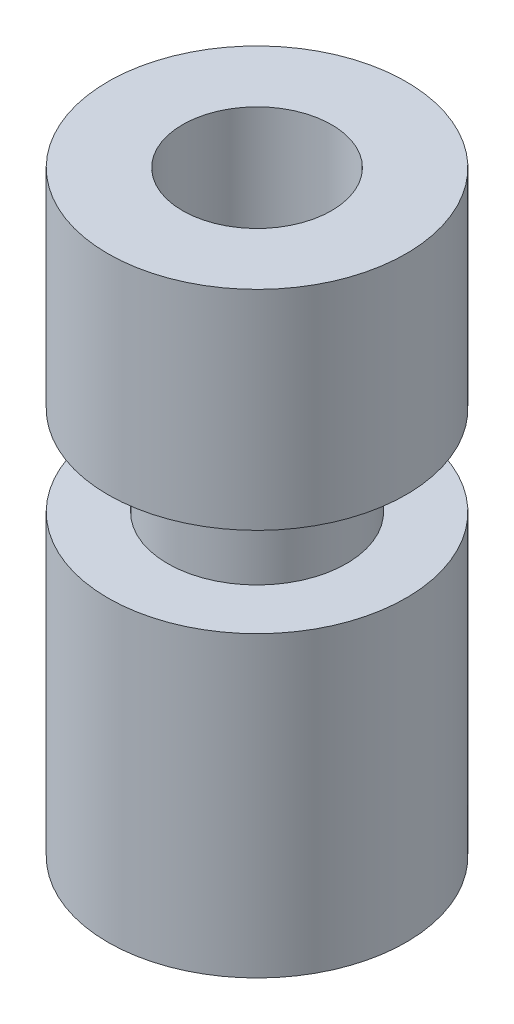
ISO-10303-21;
HEADER;
FILE_DESCRIPTION(('STEP AP214'),'2;1');
FILE_NAME('part.step','',(''),(''),'','','');
FILE_SCHEMA(('AUTOMOTIVE_DESIGN { 1 0 10303 214 1 1 1 1 }'));
ENDSEC;
DATA;
#1=APPLICATION_CONTEXT('core data for automotive mechanical design processes');
#2=APPLICATION_PROTOCOL_DEFINITION('international standard','automotive_design',2000,#1);
#3=PRODUCT_CONTEXT('',#1,'mechanical');
#4=PRODUCT('Part','Part','',(#3));
#5=PRODUCT_RELATED_PRODUCT_CATEGORY('part','',(#4));
#6=PRODUCT_DEFINITION_FORMATION('','',#4);
#7=PRODUCT_DEFINITION_CONTEXT('part definition',#1,'design');
#8=PRODUCT_DEFINITION('design','',#6,#7);
#9=PRODUCT_DEFINITION_SHAPE('','',#8);
#10=(LENGTH_UNIT() NAMED_UNIT(*) SI_UNIT(.MILLI.,.METRE.));
#11=(NAMED_UNIT(*) PLANE_ANGLE_UNIT() SI_UNIT($,.RADIAN.));
#12=(NAMED_UNIT(*) SI_UNIT($,.STERADIAN.) SOLID_ANGLE_UNIT());
#13=UNCERTAINTY_MEASURE_WITH_UNIT(LENGTH_MEASURE(1.E-05),#10,'distance_accuracy_value','');
#14=(GEOMETRIC_REPRESENTATION_CONTEXT(3) GLOBAL_UNCERTAINTY_ASSIGNED_CONTEXT((#13)) GLOBAL_UNIT_ASSIGNED_CONTEXT((#10,
#11,#12)) REPRESENTATION_CONTEXT('',''));
#15=CARTESIAN_POINT('',(0.,0.,0.));
#16=DIRECTION('',(0.,0.,1.));
#17=DIRECTION('',(1.,0.,0.));
#18=AXIS2_PLACEMENT_3D('',#15,#16,#17);
#19=CARTESIAN_POINT('',(0.,5.,0.));
#20=DIRECTION('',(0.,-1.,0.));
#21=DIRECTION('',(0.,0.,-1.));
#22=AXIS2_PLACEMENT_3D('',#19,#20,#21);
#23=CYLINDRICAL_SURFACE('',#22,2.5);
#24=CARTESIAN_POINT('',(0.,5.,0.));
#25=DIRECTION('',(0.,1.,0.));
#26=DIRECTION('',(0.,0.,1.));
#27=AXIS2_PLACEMENT_3D('',#24,#25,#26);
#28=CIRCLE('',#27,2.5);
#29=CARTESIAN_POINT('',(0.,5.,2.5));
#30=VERTEX_POINT('',#29);
#31=EDGE_CURVE('E10',#30,#30,#28,.T.);
#32=ORIENTED_EDGE('',*,*,#31,.F.);
#33=EDGE_LOOP('',(#32));
#34=FACE_BOUND('',#33,.T.);
#35=CARTESIAN_POINT('',(0.,0.,0.));
#36=DIRECTION('',(0.,1.,0.));
#37=DIRECTION('',(0.,0.,1.));
#38=AXIS2_PLACEMENT_3D('',#35,#36,#37);
#39=CIRCLE('',#38,2.5);
#40=CARTESIAN_POINT('',(0.,0.,2.5));
#41=VERTEX_POINT('',#40);
#42=EDGE_CURVE('E33',#41,#41,#39,.T.);
#43=ORIENTED_EDGE('',*,*,#42,.T.);
#44=EDGE_LOOP('',(#43));
#45=FACE_BOUND('',#44,.T.);
#46=ADVANCED_FACE('F30',(#34,#45),#23,.T.);
#47=CARTESIAN_POINT('',(0.,5.,0.));
#48=DIRECTION('',(0.,1.,0.));
#49=DIRECTION('',(0.,0.,1.));
#50=AXIS2_PLACEMENT_3D('',#47,#48,#49);
#51=PLANE('',#50);
#52=CARTESIAN_POINT('',(0.,5.,0.));
#53=DIRECTION('',(0.,1.,0.));
#54=DIRECTION('',(0.,0.,1.));
#55=AXIS2_PLACEMENT_3D('',#52,#53,#54);
#56=CIRCLE('',#55,1.5);
#57=CARTESIAN_POINT('',(0.,5.,1.5));
#58=VERTEX_POINT('',#57);
#59=EDGE_CURVE('E42',#58,#58,#56,.T.);
#60=ORIENTED_EDGE('',*,*,#59,.F.);
#61=EDGE_LOOP('',(#60));
#62=FACE_BOUND('',#61,.T.);
#63=ORIENTED_EDGE('',*,*,#31,.T.);
#64=EDGE_LOOP('',(#63));
#65=FACE_BOUND('',#64,.T.);
#66=ADVANCED_FACE('F88',(#62,#65),#51,.T.);
#67=CARTESIAN_POINT('',(0.,0.,0.));
#68=DIRECTION('',(0.,1.,0.));
#69=DIRECTION('',(0.,0.,1.));
#70=AXIS2_PLACEMENT_3D('',#67,#68,#69);
#71=PLANE('',#70);
#72=ORIENTED_EDGE('',*,*,#42,.F.);
#73=EDGE_LOOP('',(#72));
#74=FACE_BOUND('',#73,.T.);
#75=ADVANCED_FACE('F93',(#74),#71,.F.);
#76=CARTESIAN_POINT('',(0.,6.5,0.));
#77=DIRECTION('',(0.,-1.,0.));
#78=DIRECTION('',(0.,0.,-1.));
#79=AXIS2_PLACEMENT_3D('',#76,#77,#78);
#80=CYLINDRICAL_SURFACE('',#79,1.5);
#81=CARTESIAN_POINT('',(0.,6.5,0.));
#82=DIRECTION('',(0.,1.,0.));
#83=DIRECTION('',(0.,0.,1.));
#84=AXIS2_PLACEMENT_3D('',#81,#82,#83);
#85=CIRCLE('',#84,1.5);
#86=CARTESIAN_POINT('',(0.,6.5,1.5));
#87=VERTEX_POINT('',#86);
#88=EDGE_CURVE('E40',#87,#87,#85,.T.);
#89=ORIENTED_EDGE('',*,*,#88,.F.);
#90=EDGE_LOOP('',(#89));
#91=FACE_BOUND('',#90,.T.);
#92=ORIENTED_EDGE('',*,*,#59,.T.);
#93=EDGE_LOOP('',(#92));
#94=FACE_BOUND('',#93,.T.);
#95=ADVANCED_FACE('F78',(#91,#94),#80,.T.);
#96=CARTESIAN_POINT('',(0.,10.,0.));
#97=DIRECTION('',(0.,-1.,0.));
#98=DIRECTION('',(0.,0.,-1.));
#99=AXIS2_PLACEMENT_3D('',#96,#97,#98);
#100=CYLINDRICAL_SURFACE('',#99,2.5);
#101=CARTESIAN_POINT('',(0.,10.,0.));
#102=DIRECTION('',(0.,1.,0.));
#103=DIRECTION('',(0.,0.,1.));
#104=AXIS2_PLACEMENT_3D('',#101,#102,#103);
#105=CIRCLE('',#104,2.5);
#106=CARTESIAN_POINT('',(0.,10.,2.5));
#107=VERTEX_POINT('',#106);
#108=EDGE_CURVE('E45',#107,#107,#105,.T.);
#109=ORIENTED_EDGE('',*,*,#108,.F.);
#110=EDGE_LOOP('',(#109));
#111=FACE_BOUND('',#110,.T.);
#112=CARTESIAN_POINT('',(0.,6.5,0.));
#113=DIRECTION('',(0.,1.,0.));
#114=DIRECTION('',(0.,0.,1.));
#115=AXIS2_PLACEMENT_3D('',#112,#113,#114);
#116=CIRCLE('',#115,2.5);
#117=CARTESIAN_POINT('',(0.,6.5,2.5));
#118=VERTEX_POINT('',#117);
#119=EDGE_CURVE('E48',#118,#118,#116,.T.);
#120=ORIENTED_EDGE('',*,*,#119,.T.);
#121=EDGE_LOOP('',(#120));
#122=FACE_BOUND('',#121,.T.);
#123=ADVANCED_FACE('F72',(#111,#122),#100,.T.);
#124=CARTESIAN_POINT('',(0.,10.,0.));
#125=DIRECTION('',(0.,1.,0.));
#126=DIRECTION('',(0.,0.,1.));
#127=AXIS2_PLACEMENT_3D('',#124,#125,#126);
#128=PLANE('',#127);
#129=CARTESIAN_POINT('',(0.,10.,0.));
#130=DIRECTION('',(0.,1.,0.));
#131=DIRECTION('',(0.,0.,1.));
#132=AXIS2_PLACEMENT_3D('',#129,#130,#131);
#133=CIRCLE('',#132,1.25);
#134=CARTESIAN_POINT('',(0.,10.,1.25));
#135=VERTEX_POINT('',#134);
#136=EDGE_CURVE('E54',#135,#135,#133,.T.);
#137=ORIENTED_EDGE('',*,*,#136,.F.);
#138=EDGE_LOOP('',(#137));
#139=FACE_BOUND('',#138,.T.);
#140=ORIENTED_EDGE('',*,*,#108,.T.);
#141=EDGE_LOOP('',(#140));
#142=FACE_BOUND('',#141,.T.);
#143=ADVANCED_FACE('F69',(#139,#142),#128,.T.);
#144=CARTESIAN_POINT('',(0.,6.5,0.));
#145=DIRECTION('',(0.,1.,0.));
#146=DIRECTION('',(0.,0.,1.));
#147=AXIS2_PLACEMENT_3D('',#144,#145,#146);
#148=PLANE('',#147);
#149=ORIENTED_EDGE('',*,*,#88,.T.);
#150=EDGE_LOOP('',(#149));
#151=FACE_BOUND('',#150,.T.);
#152=ORIENTED_EDGE('',*,*,#119,.F.);
#153=EDGE_LOOP('',(#152));
#154=FACE_BOUND('',#153,.T.);
#155=ADVANCED_FACE('F65',(#151,#154),#148,.F.);
#156=CARTESIAN_POINT('',(0.,8.,0.));
#157=DIRECTION('',(0.,1.,0.));
#158=DIRECTION('',(0.,0.,1.));
#159=AXIS2_PLACEMENT_3D('',#156,#157,#158);
#160=CYLINDRICAL_SURFACE('',#159,1.25);
#161=CARTESIAN_POINT('',(0.,8.,0.));
#162=DIRECTION('',(0.,1.,0.));
#163=DIRECTION('',(0.,0.,1.));
#164=AXIS2_PLACEMENT_3D('',#161,#162,#163);
#165=CIRCLE('',#164,1.25);
#166=CARTESIAN_POINT('',(0.,8.,1.25));
#167=VERTEX_POINT('',#166);
#168=EDGE_CURVE('E51',#167,#167,#165,.T.);
#169=ORIENTED_EDGE('',*,*,#168,.F.);
#170=EDGE_LOOP('',(#169));
#171=FACE_BOUND('',#170,.T.);
#172=ORIENTED_EDGE('',*,*,#136,.T.);
#173=EDGE_LOOP('',(#172));
#174=FACE_BOUND('',#173,.T.);
#175=ADVANCED_FACE('F62',(#171,#174),#160,.F.);
#176=CARTESIAN_POINT('',(0.,8.,0.));
#177=DIRECTION('',(0.,1.,0.));
#178=DIRECTION('',(0.,0.,1.));
#179=AXIS2_PLACEMENT_3D('',#176,#177,#178);
#180=PLANE('',#179);
#181=ORIENTED_EDGE('',*,*,#168,.T.);
#182=EDGE_LOOP('',(#181));
#183=FACE_BOUND('',#182,.T.);
#184=ADVANCED_FACE('F60',(#183),#180,.T.);
#185=CLOSED_SHELL('',(#46,#66,#75,#95,#123,#143,#155,#175,#184));
#186=MANIFOLD_SOLID_BREP('B2',#185);
#187=ADVANCED_BREP_SHAPE_REPRESENTATION('',(#18,#186),#14);
#188=SHAPE_DEFINITION_REPRESENTATION(#9,#187);
ENDSEC;
END-ISO-10303-21;
